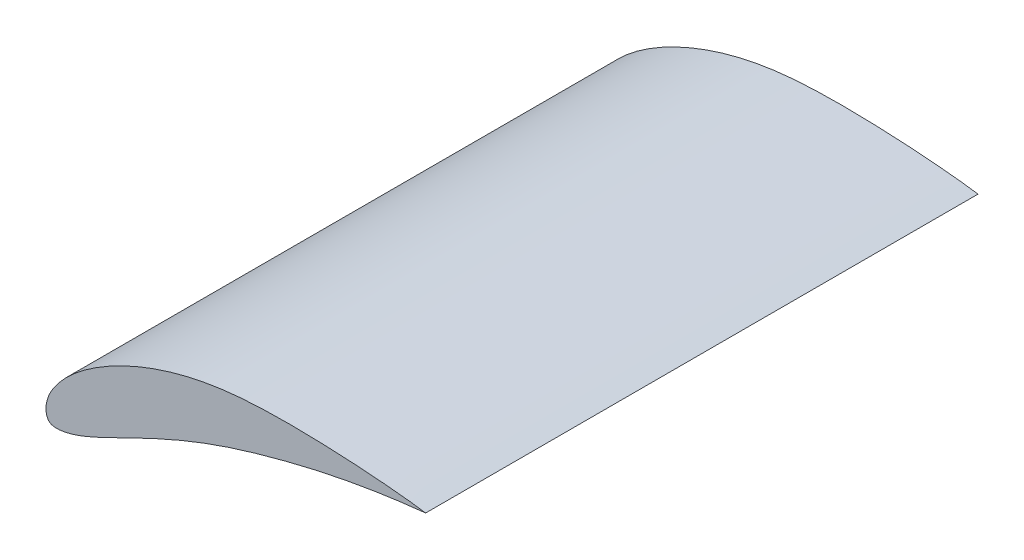
ISO-10303-21;
HEADER;
FILE_DESCRIPTION(('STEP AP214'),'2;1');
FILE_NAME('part.step','',(''),(''),'','','');
FILE_SCHEMA(('AUTOMOTIVE_DESIGN { 1 0 10303 214 1 1 1 1 }'));
ENDSEC;
DATA;
#1=APPLICATION_CONTEXT('core data for automotive mechanical design processes');
#2=APPLICATION_PROTOCOL_DEFINITION('international standard','automotive_design',2000,#1);
#3=PRODUCT_CONTEXT('',#1,'mechanical');
#4=PRODUCT('Part','Part','',(#3));
#5=PRODUCT_RELATED_PRODUCT_CATEGORY('part','',(#4));
#6=PRODUCT_DEFINITION_FORMATION('','',#4);
#7=PRODUCT_DEFINITION_CONTEXT('part definition',#1,'design');
#8=PRODUCT_DEFINITION('design','',#6,#7);
#9=PRODUCT_DEFINITION_SHAPE('','',#8);
#10=(LENGTH_UNIT() NAMED_UNIT(*) SI_UNIT(.MILLI.,.METRE.));
#11=(NAMED_UNIT(*) PLANE_ANGLE_UNIT() SI_UNIT($,.RADIAN.));
#12=(NAMED_UNIT(*) SI_UNIT($,.STERADIAN.) SOLID_ANGLE_UNIT());
#13=UNCERTAINTY_MEASURE_WITH_UNIT(LENGTH_MEASURE(1.E-05),#10,'distance_accuracy_value','');
#14=(GEOMETRIC_REPRESENTATION_CONTEXT(3) GLOBAL_UNCERTAINTY_ASSIGNED_CONTEXT((#13)) GLOBAL_UNIT_ASSIGNED_CONTEXT((#10,
#11,#12)) REPRESENTATION_CONTEXT('',''));
#15=CARTESIAN_POINT('',(0.,0.,0.));
#16=DIRECTION('',(0.,0.,1.));
#17=DIRECTION('',(1.,0.,0.));
#18=AXIS2_PLACEMENT_3D('',#15,#16,#17);
#19=CARTESIAN_POINT('',(643.643746681753,374.253016038156,254.));
#20=CARTESIAN_POINT('',(643.617138135385,374.184078824143,254.));
#21=CARTESIAN_POINT('',(643.58941791706,374.111226626738,254.));
#22=CARTESIAN_POINT('',(643.53619292433,373.969133144639,254.));
#23=CARTESIAN_POINT('',(643.457469513711,373.755686011498,254.));
#24=CARTESIAN_POINT('',(643.382181673522,373.541292436139,254.));
#25=CARTESIAN_POINT('',(643.236438857388,373.111173912089,254.));
#26=CARTESIAN_POINT('',(643.145718636259,372.822653660748,254.));
#27=CARTESIAN_POINT('',(642.894970721538,371.951194052363,254.));
#28=CARTESIAN_POINT('',(642.756237725271,371.362388362139,254.));
#29=CARTESIAN_POINT('',(642.54826652878,370.165632326931,254.));
#30=CARTESIAN_POINT('',(642.480488301693,369.56167050835,254.));
#31=CARTESIAN_POINT('',(642.438540802824,368.356846725056,254.));
#32=CARTESIAN_POINT('',(642.46080361236,367.753826323883,254.));
#33=CARTESIAN_POINT('',(642.637736208582,366.545922031292,254.));
#34=CARTESIAN_POINT('',(642.79440565974,365.95981623996,254.));
#35=CARTESIAN_POINT('',(643.104100127178,365.264567080586,254.));
#36=CARTESIAN_POINT('',(643.172144839641,365.126592853052,254.));
#37=CARTESIAN_POINT('',(643.321958740104,364.861040293455,254.));
#38=CARTESIAN_POINT('',(643.403948784809,364.733293977173,254.));
#39=CARTESIAN_POINT('',(643.57981716348,364.486243651994,254.));
#40=CARTESIAN_POINT('',(643.673325653345,364.366677003315,254.));
#41=CARTESIAN_POINT('',(643.882500621298,364.143278900859,254.));
#42=CARTESIAN_POINT('',(643.996016029418,364.03817321312,254.));
#43=CARTESIAN_POINT('',(644.237909259351,363.855539705826,254.));
#44=CARTESIAN_POINT('',(644.367754435771,363.777678285456,254.));
#45=CARTESIAN_POINT('',(644.639031982744,363.639476204448,254.));
#46=CARTESIAN_POINT('',(644.780130601404,363.577467219907,254.));
#47=CARTESIAN_POINT('',(645.207990721305,363.419816375204,254.));
#48=CARTESIAN_POINT('',(645.502350868641,363.349487623863,254.));
#49=CARTESIAN_POINT('',(646.099278537089,363.240122132161,254.));
#50=CARTESIAN_POINT('',(646.40291832157,363.205248636639,254.));
#51=CARTESIAN_POINT('',(647.008369674225,363.161711219934,254.));
#52=CARTESIAN_POINT('',(647.311567795648,363.152642425979,254.));
#53=CARTESIAN_POINT('',(647.918781711629,363.156484915633,254.));
#54=CARTESIAN_POINT('',(648.224053481364,363.169569872148,254.));
#55=CARTESIAN_POINT('',(648.825248237038,363.213608160098,254.));
#56=CARTESIAN_POINT('',(649.122121972008,363.24447100176,254.));
#57=CARTESIAN_POINT('',(650.004207275419,363.357332398297,254.));
#58=CARTESIAN_POINT('',(650.581029894876,363.459254810439,254.));
#59=CARTESIAN_POINT('',(652.294582988224,363.80519482247,254.));
#60=CARTESIAN_POINT('',(653.412147538761,364.094731726874,254.));
#61=CARTESIAN_POINT('',(656.717353444151,365.076126423039,254.));
#62=CARTESIAN_POINT('',(658.860164815496,365.874455978868,254.));
#63=CARTESIAN_POINT('',(663.094560196538,367.592780706439,254.));
#64=CARTESIAN_POINT('',(665.183901775673,368.518101678461,254.));
#65=CARTESIAN_POINT('',(669.332696868402,370.439728146893,254.));
#66=CARTESIAN_POINT('',(671.391847766029,371.436752359986,254.));
#67=CARTESIAN_POINT('',(675.500510569456,373.453693510592,254.));
#68=CARTESIAN_POINT('',(677.550046799208,374.473552678529,254.));
#69=CARTESIAN_POINT('',(681.654087685115,376.501470940399,254.));
#70=CARTESIAN_POINT('',(683.709447299721,377.507499497463,254.));
#71=CARTESIAN_POINT('',(689.894945052522,380.479465020123,254.));
#72=CARTESIAN_POINT('',(694.043761800225,382.401040057764,254.));
#73=CARTESIAN_POINT('',(700.31708043346,385.164429905894,254.));
#74=CARTESIAN_POINT('',(702.416290119958,386.066314001122,254.));
#75=CARTESIAN_POINT('',(706.632667907881,387.827430734641,254.));
#76=CARTESIAN_POINT('',(708.750650321939,388.686798578852,254.));
#77=CARTESIAN_POINT('',(715.125529521425,391.188567742803,254.));
#78=CARTESIAN_POINT('',(719.406419697536,392.751975841404,254.));
#79=CARTESIAN_POINT('',(728.026594360652,395.681877415004,254.));
#80=CARTESIAN_POINT('',(732.366240874718,397.047150078889,254.));
#81=CARTESIAN_POINT('',(741.088732972371,399.632021480687,254.));
#82=CARTESIAN_POINT('',(745.471041032064,400.853432832142,254.));
#83=CARTESIAN_POINT('',(754.27276127006,403.171134723726,254.));
#84=CARTESIAN_POINT('',(758.692058589464,404.267812585855,254.));
#85=CARTESIAN_POINT('',(767.568444840946,406.333729162679,254.));
#86=CARTESIAN_POINT('',(772.028934214883,407.303713771938,254.));
#87=CARTESIAN_POINT('',(780.97006311231,409.091207648298,254.));
#88=CARTESIAN_POINT('',(785.451641989703,409.909298890057,254.));
#89=CARTESIAN_POINT('',(794.436618150919,411.395615522001,254.));
#90=CARTESIAN_POINT('',(798.939714211121,412.065909951217,254.));
#91=CARTESIAN_POINT('',(807.965019934059,413.275211663128,254.));
#92=CARTESIAN_POINT('',(812.487344734258,413.813428091897,254.));
#93=CARTESIAN_POINT('',(817.027491886607,414.28380054752,254.));
#94=CARTESIAN_POINT('',(817.035319061306,414.284611257503,254.));
#95=CARTESIAN_POINT('',(817.043146265864,414.285421762399,254.));
#96=B_SPLINE_CURVE_WITH_KNOTS('',3,(#19,#20,#21,#22,#23,#24,#25,#26,#27,#28,#29,#30,#31,#32,#33,
#34,#35,#36,#37,#38,#39,#40,#41,#42,#43,#44,#45,#46,#47,#48,#49,#50,#51,#52,#53,#54,#55,#56,#57,
#58,#59,#60,#61,#62,#63,#64,#65,#66,#67,#68,#69,#70,#71,#72,#73,#74,#75,#76,#77,#78,#79,#80,#81,
#82,#83,#84,#85,#86,#87,#88,#89,#90,#91,#92,#93,#94,#95),.UNSPECIFIED.,.F.,.F.,(4,2,1,2,2,2,2,2,
2,2,2,2,2,2,2,2,2,2,2,2,2,2,2,2,2,2,2,2,2,2,2,2,2,2,2,2,2,2,4),(0.,0.00048828125,
0.000976562500000999,0.001953125000002,0.003906250000002,0.0078125,0.011718750000004,0.015625,
0.019531250000006,0.020507812500006,0.021484375000006,0.022460937500006,0.0234375,
0.024414062500007,0.025390625000007,0.027343750000008,0.029296875000008,0.03125,
0.03320312500001,0.035156250000011,0.039062500000012,0.046875000000015,0.062500000000019,
0.078125000000022,0.093750000000026,0.10937500000003,0.125000000000034,0.156250000000043,
0.171875000000047,0.187500000000051,0.218750000000059,0.250000000000067,0.281250000000075,
0.312500000000084,0.343750000000092,0.375000000000101,0.406250000000109,0.437500000000118,
0.437553967565578),.UNSPECIFIED.);
#97=DIRECTION('',(0.,0.,-1.));
#98=VECTOR('',#97,1.);
#99=SURFACE_OF_LINEAR_EXTRUSION('',#96,#98);
#100=CARTESIAN_POINT('',(643.643746681753,374.253016038156,0.));
#101=CARTESIAN_POINT('',(643.617138135385,374.184078824143,0.));
#102=CARTESIAN_POINT('',(643.58941791706,374.111226626738,0.));
#103=CARTESIAN_POINT('',(643.53619292433,373.969133144639,0.));
#104=CARTESIAN_POINT('',(643.457469513711,373.755686011498,0.));
#105=CARTESIAN_POINT('',(643.382181673522,373.541292436139,0.));
#106=CARTESIAN_POINT('',(643.236438857388,373.111173912089,0.));
#107=CARTESIAN_POINT('',(643.145718636259,372.822653660748,0.));
#108=CARTESIAN_POINT('',(642.894970721538,371.951194052363,0.));
#109=CARTESIAN_POINT('',(642.756237725271,371.362388362139,0.));
#110=CARTESIAN_POINT('',(642.54826652878,370.165632326931,0.));
#111=CARTESIAN_POINT('',(642.480488301693,369.56167050835,0.));
#112=CARTESIAN_POINT('',(642.438540802824,368.356846725056,0.));
#113=CARTESIAN_POINT('',(642.46080361236,367.753826323883,0.));
#114=CARTESIAN_POINT('',(642.637736208582,366.545922031292,0.));
#115=CARTESIAN_POINT('',(642.79440565974,365.95981623996,0.));
#116=CARTESIAN_POINT('',(643.104100127178,365.264567080586,0.));
#117=CARTESIAN_POINT('',(643.172144839641,365.126592853052,0.));
#118=CARTESIAN_POINT('',(643.321958740104,364.861040293455,0.));
#119=CARTESIAN_POINT('',(643.403948784809,364.733293977173,0.));
#120=CARTESIAN_POINT('',(643.57981716348,364.486243651994,0.));
#121=CARTESIAN_POINT('',(643.673325653345,364.366677003315,0.));
#122=CARTESIAN_POINT('',(643.882500621298,364.143278900859,0.));
#123=CARTESIAN_POINT('',(643.996016029418,364.03817321312,0.));
#124=CARTESIAN_POINT('',(644.237909259351,363.855539705826,0.));
#125=CARTESIAN_POINT('',(644.367754435771,363.777678285456,0.));
#126=CARTESIAN_POINT('',(644.639031982744,363.639476204448,0.));
#127=CARTESIAN_POINT('',(644.780130601404,363.577467219907,0.));
#128=CARTESIAN_POINT('',(645.207990721305,363.419816375204,0.));
#129=CARTESIAN_POINT('',(645.502350868641,363.349487623863,0.));
#130=CARTESIAN_POINT('',(646.099278537089,363.240122132161,0.));
#131=CARTESIAN_POINT('',(646.40291832157,363.205248636639,0.));
#132=CARTESIAN_POINT('',(647.008369674225,363.161711219934,0.));
#133=CARTESIAN_POINT('',(647.311567795648,363.152642425979,0.));
#134=CARTESIAN_POINT('',(647.918781711629,363.156484915633,0.));
#135=CARTESIAN_POINT('',(648.224053481364,363.169569872148,0.));
#136=CARTESIAN_POINT('',(648.825248237038,363.213608160098,0.));
#137=CARTESIAN_POINT('',(649.122121972008,363.24447100176,0.));
#138=CARTESIAN_POINT('',(650.004207275419,363.357332398297,0.));
#139=CARTESIAN_POINT('',(650.581029894876,363.459254810439,0.));
#140=CARTESIAN_POINT('',(652.294582988224,363.80519482247,0.));
#141=CARTESIAN_POINT('',(653.412147538761,364.094731726874,0.));
#142=CARTESIAN_POINT('',(656.717353444151,365.076126423039,0.));
#143=CARTESIAN_POINT('',(658.860164815496,365.874455978868,0.));
#144=CARTESIAN_POINT('',(663.094560196538,367.592780706439,0.));
#145=CARTESIAN_POINT('',(665.183901775673,368.518101678461,0.));
#146=CARTESIAN_POINT('',(669.332696868402,370.439728146893,0.));
#147=CARTESIAN_POINT('',(671.391847766029,371.436752359986,0.));
#148=CARTESIAN_POINT('',(675.500510569456,373.453693510592,0.));
#149=CARTESIAN_POINT('',(677.550046799208,374.473552678529,0.));
#150=CARTESIAN_POINT('',(681.654087685115,376.501470940399,0.));
#151=CARTESIAN_POINT('',(683.709447299721,377.507499497463,0.));
#152=CARTESIAN_POINT('',(689.894945052522,380.479465020123,0.));
#153=CARTESIAN_POINT('',(694.043761800225,382.401040057764,0.));
#154=CARTESIAN_POINT('',(700.31708043346,385.164429905894,0.));
#155=CARTESIAN_POINT('',(702.416290119958,386.066314001122,0.));
#156=CARTESIAN_POINT('',(706.632667907881,387.827430734641,0.));
#157=CARTESIAN_POINT('',(708.750650321939,388.686798578852,0.));
#158=CARTESIAN_POINT('',(715.125529521425,391.188567742803,0.));
#159=CARTESIAN_POINT('',(719.406419697536,392.751975841404,0.));
#160=CARTESIAN_POINT('',(728.026594360652,395.681877415004,0.));
#161=CARTESIAN_POINT('',(732.366240874718,397.047150078889,0.));
#162=CARTESIAN_POINT('',(741.088732972371,399.632021480687,0.));
#163=CARTESIAN_POINT('',(745.471041032064,400.853432832142,0.));
#164=CARTESIAN_POINT('',(754.27276127006,403.171134723726,0.));
#165=CARTESIAN_POINT('',(758.692058589464,404.267812585855,0.));
#166=CARTESIAN_POINT('',(767.568444840946,406.333729162679,0.));
#167=CARTESIAN_POINT('',(772.028934214883,407.303713771938,0.));
#168=CARTESIAN_POINT('',(780.97006311231,409.091207648298,0.));
#169=CARTESIAN_POINT('',(785.451641989703,409.909298890057,0.));
#170=CARTESIAN_POINT('',(794.436618150919,411.395615522001,0.));
#171=CARTESIAN_POINT('',(798.939714211121,412.065909951217,0.));
#172=CARTESIAN_POINT('',(807.965019934059,413.275211663128,0.));
#173=CARTESIAN_POINT('',(812.487344734258,413.813428091897,0.));
#174=CARTESIAN_POINT('',(817.027491886607,414.28380054752,0.));
#175=CARTESIAN_POINT('',(817.035319061306,414.284611257503,0.));
#176=CARTESIAN_POINT('',(817.043146265864,414.285421762399,0.));
#177=B_SPLINE_CURVE_WITH_KNOTS('',3,(#100,#101,#102,#103,#104,#105,#106,#107,#108,#109,#110,
#111,#112,#113,#114,#115,#116,#117,#118,#119,#120,#121,#122,#123,#124,#125,#126,#127,#128,#129,
#130,#131,#132,#133,#134,#135,#136,#137,#138,#139,#140,#141,#142,#143,#144,#145,#146,#147,#148,
#149,#150,#151,#152,#153,#154,#155,#156,#157,#158,#159,#160,#161,#162,#163,#164,#165,#166,#167,
#168,#169,#170,#171,#172,#173,#174,#175,#176),.UNSPECIFIED.,.F.,.F.,(4,2,1,2,2,2,2,2,2,2,2,2,2,
2,2,2,2,2,2,2,2,2,2,2,2,2,2,2,2,2,2,2,2,2,2,2,2,2,4),(0.,0.00048828125,0.000976562500000999,
0.001953125000002,0.003906250000002,0.0078125,0.011718750000004,0.015625,0.019531250000006,
0.020507812500006,0.021484375000006,0.022460937500006,0.0234375,0.024414062500007,
0.025390625000007,0.027343750000008,0.029296875000008,0.03125,0.03320312500001,
0.035156250000011,0.039062500000012,0.046875000000015,0.062500000000019,0.078125000000022,
0.093750000000026,0.10937500000003,0.125000000000034,0.156250000000043,0.171875000000047,
0.187500000000051,0.218750000000059,0.250000000000067,0.281250000000075,0.312500000000084,
0.343750000000092,0.375000000000101,0.406250000000109,0.437500000000118,0.437553967565578),.UNSPECIFIED.);
#178=CARTESIAN_POINT('',(643.643746681753,374.253016038156,0.));
#179=VERTEX_POINT('',#178);
#180=CARTESIAN_POINT('',(817.043146265864,414.285421762399,0.));
#181=VERTEX_POINT('',#180);
#182=EDGE_CURVE('E64',#179,#181,#177,.T.);
#183=ORIENTED_EDGE('',*,*,#182,.T.);
#184=DIRECTION('',(0.,0.,-1.));
#185=VECTOR('',#184,1.);
#186=CARTESIAN_POINT('',(817.043146265864,414.285421762399,254.));
#187=LINE('',#186,#185);
#188=CARTESIAN_POINT('',(817.043146265864,414.285421762399,254.));
#189=VERTEX_POINT('',#188);
#190=EDGE_CURVE('E11',#189,#181,#187,.T.);
#191=ORIENTED_EDGE('',*,*,#190,.F.);
#192=CARTESIAN_POINT('',(643.643746681753,374.253016038156,254.));
#193=VERTEX_POINT('',#192);
#194=EDGE_CURVE('E63',#193,#189,#96,.T.);
#195=ORIENTED_EDGE('',*,*,#194,.F.);
#196=DIRECTION('',(0.,0.,-1.));
#197=VECTOR('',#196,1.);
#198=CARTESIAN_POINT('',(643.643746681753,374.253016038156,254.));
#199=LINE('',#198,#197);
#200=EDGE_CURVE('E41',#193,#179,#199,.T.);
#201=ORIENTED_EDGE('',*,*,#200,.T.);
#202=EDGE_LOOP('',(#183,#191,#195,#201));
#203=FACE_BOUND('',#202,.T.);
#204=ADVANCED_FACE('F32',(#203),#99,.F.);
#205=CARTESIAN_POINT('',(817.043146265864,414.285421762399,254.));
#206=CARTESIAN_POINT('',(815.109802965986,414.5944745138,254.));
#207=CARTESIAN_POINT('',(813.166057631755,414.850938766852,254.));
#208=CARTESIAN_POINT('',(809.077241324448,415.350690100673,254.));
#209=CARTESIAN_POINT('',(806.931247772888,415.584421162032,254.));
#210=CARTESIAN_POINT('',(802.638777841114,416.017389479847,254.));
#211=CARTESIAN_POINT('',(800.491212623468,416.215618502029,254.));
#212=CARTESIAN_POINT('',(794.045530080793,416.769316273961,254.));
#213=CARTESIAN_POINT('',(789.744487104047,417.08463610284,254.));
#214=CARTESIAN_POINT('',(781.135734712443,417.623791769826,254.));
#215=CARTESIAN_POINT('',(776.827909215461,417.846034604589,254.));
#216=CARTESIAN_POINT('',(768.204985989521,418.190722932303,254.));
#217=CARTESIAN_POINT('',(763.894434314753,418.312730873333,254.));
#218=CARTESIAN_POINT('',(755.284956146785,418.426779361805,254.));
#219=CARTESIAN_POINT('',(750.984850002281,418.418244008508,254.));
#220=CARTESIAN_POINT('',(742.396452254131,418.233988614436,254.));
#221=CARTESIAN_POINT('',(738.108101862804,418.059100463026,254.));
#222=CARTESIAN_POINT('',(729.550126330549,417.444347705997,254.));
#223=CARTESIAN_POINT('',(725.281236207006,416.994082048448,254.));
#224=CARTESIAN_POINT('',(716.767976429249,415.746567547785,254.));
#225=CARTESIAN_POINT('',(712.523410362865,414.952098085438,254.));
#226=CARTESIAN_POINT('',(707.234104448745,413.726915239273,254.));
#227=CARTESIAN_POINT('',(706.175837551794,413.469952739918,254.));
#228=CARTESIAN_POINT('',(704.068342858959,412.934200146835,254.));
#229=CARTESIAN_POINT('',(703.01910979447,412.655446416089,254.));
#230=CARTESIAN_POINT('',(699.885031734733,411.786364282303,254.));
#231=CARTESIAN_POINT('',(697.813800993373,411.163231514736,254.));
#232=CARTESIAN_POINT('',(691.655458910571,409.160463714169,254.));
#233=CARTESIAN_POINT('',(687.62413413754,407.646407585829,254.));
#234=CARTESIAN_POINT('',(679.713069759601,404.253041740086,254.));
#235=CARTESIAN_POINT('',(675.831208737694,402.378843704647,254.));
#236=CARTESIAN_POINT('',(670.138940348561,399.253043278291,254.));
#237=CARTESIAN_POINT('',(668.263555084194,398.1580090426,254.));
#238=CARTESIAN_POINT('',(664.564078817619,395.844343958372,254.));
#239=CARTESIAN_POINT('',(662.754760090717,394.635266563984,254.));
#240=CARTESIAN_POINT('',(659.236808224653,392.100521210755,254.));
#241=CARTESIAN_POINT('',(657.526822975297,390.774563344365,254.));
#242=CARTESIAN_POINT('',(654.227739568982,387.97808556996,254.));
#243=CARTESIAN_POINT('',(652.637702456495,386.508688505854,254.));
#244=CARTESIAN_POINT('',(650.374220485453,384.159209795667,254.));
#245=CARTESIAN_POINT('',(649.639946963307,383.35186971047,254.));
#246=CARTESIAN_POINT('',(648.221792143816,381.67692832655,254.));
#247=CARTESIAN_POINT('',(647.541990898017,380.814295074564,254.));
#248=CARTESIAN_POINT('',(646.264693912656,379.042972519737,254.));
#249=CARTESIAN_POINT('',(645.665957309948,378.132089751802,254.));
#250=CARTESIAN_POINT('',(644.568425728517,376.247168180848,254.));
#251=CARTESIAN_POINT('',(644.070127169487,375.272815675727,254.));
#252=CARTESIAN_POINT('',(643.643746681753,374.253016038156,254.));
#253=B_SPLINE_CURVE_WITH_KNOTS('',3,(#205,#206,#207,#208,#209,#210,#211,#212,#213,#214,#215,
#216,#217,#218,#219,#220,#221,#222,#223,#224,#225,#226,#227,#228,#229,#230,#231,#232,#233,#234,
#235,#236,#237,#238,#239,#240,#241,#242,#243,#244,#245,#246,#247,#248,#249,#250,#251,#252),
.UNSPECIFIED.,.F.,.F.,(4,2,2,2,2,2,2,2,2,2,2,2,2,2,2,2,2,2,2,2,2,2,2,4),(0.548290738094153,
0.562500000000108,0.578125000000103,0.593750000000098,0.625000000000087,0.656250000000077,
0.687500000000067,0.718750000000056,0.750000000000045,0.781250000000035,0.812500000000025,
0.820312500000023,0.828125000000021,0.843750000000018,0.875000000000013,0.906250000000009,
0.921875000000007,0.937500000000006,0.953125000000004,0.968750000000003,0.976562500000002,
0.984375000000002,0.992187500000001,1.),.UNSPECIFIED.);
#254=DIRECTION('',(0.,0.,-1.));
#255=VECTOR('',#254,1.);
#256=SURFACE_OF_LINEAR_EXTRUSION('',#253,#255);
#257=CARTESIAN_POINT('',(817.043146265864,414.285421762399,0.));
#258=CARTESIAN_POINT('',(815.109802965986,414.5944745138,0.));
#259=CARTESIAN_POINT('',(813.166057631755,414.850938766852,0.));
#260=CARTESIAN_POINT('',(809.077241324448,415.350690100673,0.));
#261=CARTESIAN_POINT('',(806.931247772888,415.584421162032,0.));
#262=CARTESIAN_POINT('',(802.638777841114,416.017389479847,0.));
#263=CARTESIAN_POINT('',(800.491212623468,416.215618502029,0.));
#264=CARTESIAN_POINT('',(794.045530080793,416.769316273961,0.));
#265=CARTESIAN_POINT('',(789.744487104047,417.08463610284,0.));
#266=CARTESIAN_POINT('',(781.135734712443,417.623791769826,0.));
#267=CARTESIAN_POINT('',(776.827909215461,417.846034604589,0.));
#268=CARTESIAN_POINT('',(768.204985989521,418.190722932303,0.));
#269=CARTESIAN_POINT('',(763.894434314753,418.312730873333,0.));
#270=CARTESIAN_POINT('',(755.284956146785,418.426779361805,0.));
#271=CARTESIAN_POINT('',(750.984850002281,418.418244008508,0.));
#272=CARTESIAN_POINT('',(742.396452254131,418.233988614436,0.));
#273=CARTESIAN_POINT('',(738.108101862804,418.059100463026,0.));
#274=CARTESIAN_POINT('',(729.550126330549,417.444347705997,0.));
#275=CARTESIAN_POINT('',(725.281236207006,416.994082048448,0.));
#276=CARTESIAN_POINT('',(716.767976429249,415.746567547785,0.));
#277=CARTESIAN_POINT('',(712.523410362865,414.952098085438,0.));
#278=CARTESIAN_POINT('',(707.234104448745,413.726915239273,0.));
#279=CARTESIAN_POINT('',(706.175837551794,413.469952739918,0.));
#280=CARTESIAN_POINT('',(704.068342858959,412.934200146835,0.));
#281=CARTESIAN_POINT('',(703.01910979447,412.655446416089,0.));
#282=CARTESIAN_POINT('',(699.885031734733,411.786364282303,0.));
#283=CARTESIAN_POINT('',(697.813800993373,411.163231514736,0.));
#284=CARTESIAN_POINT('',(691.655458910571,409.160463714169,0.));
#285=CARTESIAN_POINT('',(687.62413413754,407.646407585829,0.));
#286=CARTESIAN_POINT('',(679.713069759601,404.253041740086,0.));
#287=CARTESIAN_POINT('',(675.831208737694,402.378843704647,0.));
#288=CARTESIAN_POINT('',(670.138940348561,399.253043278291,0.));
#289=CARTESIAN_POINT('',(668.263555084194,398.1580090426,0.));
#290=CARTESIAN_POINT('',(664.564078817619,395.844343958372,0.));
#291=CARTESIAN_POINT('',(662.754760090717,394.635266563984,0.));
#292=CARTESIAN_POINT('',(659.236808224653,392.100521210755,0.));
#293=CARTESIAN_POINT('',(657.526822975297,390.774563344365,0.));
#294=CARTESIAN_POINT('',(654.227739568982,387.97808556996,0.));
#295=CARTESIAN_POINT('',(652.637702456495,386.508688505854,0.));
#296=CARTESIAN_POINT('',(650.374220485453,384.159209795667,0.));
#297=CARTESIAN_POINT('',(649.639946963307,383.35186971047,0.));
#298=CARTESIAN_POINT('',(648.221792143816,381.67692832655,0.));
#299=CARTESIAN_POINT('',(647.541990898017,380.814295074564,0.));
#300=CARTESIAN_POINT('',(646.264693912656,379.042972519737,0.));
#301=CARTESIAN_POINT('',(645.665957309948,378.132089751802,0.));
#302=CARTESIAN_POINT('',(644.568425728517,376.247168180848,0.));
#303=CARTESIAN_POINT('',(644.070127169487,375.272815675727,0.));
#304=CARTESIAN_POINT('',(643.643746681753,374.253016038156,0.));
#305=B_SPLINE_CURVE_WITH_KNOTS('',3,(#257,#258,#259,#260,#261,#262,#263,#264,#265,#266,#267,
#268,#269,#270,#271,#272,#273,#274,#275,#276,#277,#278,#279,#280,#281,#282,#283,#284,#285,#286,
#287,#288,#289,#290,#291,#292,#293,#294,#295,#296,#297,#298,#299,#300,#301,#302,#303,#304),
.UNSPECIFIED.,.F.,.F.,(4,2,2,2,2,2,2,2,2,2,2,2,2,2,2,2,2,2,2,2,2,2,2,4),(0.548290738094153,
0.562500000000108,0.578125000000103,0.593750000000098,0.625000000000087,0.656250000000077,
0.687500000000067,0.718750000000056,0.750000000000045,0.781250000000035,0.812500000000025,
0.820312500000023,0.828125000000021,0.843750000000018,0.875000000000013,0.906250000000009,
0.921875000000007,0.937500000000006,0.953125000000004,0.968750000000003,0.976562500000002,
0.984375000000002,0.992187500000001,1.),.UNSPECIFIED.);
#306=EDGE_CURVE('E56',#181,#179,#305,.T.);
#307=ORIENTED_EDGE('',*,*,#306,.T.);
#308=ORIENTED_EDGE('',*,*,#200,.F.);
#309=EDGE_CURVE('E48',#189,#193,#253,.T.);
#310=ORIENTED_EDGE('',*,*,#309,.F.);
#311=ORIENTED_EDGE('',*,*,#190,.T.);
#312=EDGE_LOOP('',(#307,#308,#310,#311));
#313=FACE_BOUND('',#312,.T.);
#314=ADVANCED_FACE('F59',(#313),#256,.F.);
#315=CARTESIAN_POINT('',(723.727672131377,394.220721276981,254.));
#316=DIRECTION('',(0.,0.,-1.));
#317=DIRECTION('',(-1.,0.,0.));
#318=AXIS2_PLACEMENT_3D('',#315,#316,#317);
#319=PLANE('',#318);
#320=ORIENTED_EDGE('',*,*,#194,.T.);
#321=ORIENTED_EDGE('',*,*,#309,.T.);
#322=EDGE_LOOP('',(#320,#321));
#323=FACE_BOUND('',#322,.T.);
#324=ADVANCED_FACE('F91',(#323),#319,.F.);
#325=CARTESIAN_POINT('',(723.727672131377,394.220721276981,0.));
#326=DIRECTION('',(0.,0.,-1.));
#327=DIRECTION('',(-1.,0.,0.));
#328=AXIS2_PLACEMENT_3D('',#325,#326,#327);
#329=PLANE('',#328);
#330=ORIENTED_EDGE('',*,*,#182,.F.);
#331=ORIENTED_EDGE('',*,*,#306,.F.);
#332=EDGE_LOOP('',(#330,#331));
#333=FACE_BOUND('',#332,.T.);
#334=ADVANCED_FACE('F67',(#333),#329,.T.);
#335=CLOSED_SHELL('',(#204,#314,#324,#334));
#336=MANIFOLD_SOLID_BREP('B2',#335);
#337=ADVANCED_BREP_SHAPE_REPRESENTATION('',(#18,#336),#14);
#338=SHAPE_DEFINITION_REPRESENTATION(#9,#337);
ENDSEC;
END-ISO-10303-21;
